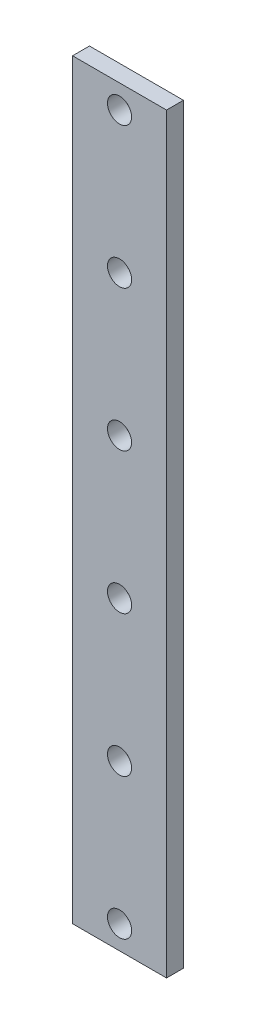
ISO-10303-21;
HEADER;
FILE_DESCRIPTION(('STEP AP214'),'2;1');
FILE_NAME('part.step','',(''),(''),'','','');
FILE_SCHEMA(('AUTOMOTIVE_DESIGN { 1 0 10303 214 1 1 1 1 }'));
ENDSEC;
DATA;
#1=APPLICATION_CONTEXT('core data for automotive mechanical design processes');
#2=APPLICATION_PROTOCOL_DEFINITION('international standard','automotive_design',2000,#1);
#3=PRODUCT_CONTEXT('',#1,'mechanical');
#4=PRODUCT('Part','Part','',(#3));
#5=PRODUCT_RELATED_PRODUCT_CATEGORY('part','',(#4));
#6=PRODUCT_DEFINITION_FORMATION('','',#4);
#7=PRODUCT_DEFINITION_CONTEXT('part definition',#1,'design');
#8=PRODUCT_DEFINITION('design','',#6,#7);
#9=PRODUCT_DEFINITION_SHAPE('','',#8);
#10=(LENGTH_UNIT() NAMED_UNIT(*) SI_UNIT(.MILLI.,.METRE.));
#11=(NAMED_UNIT(*) PLANE_ANGLE_UNIT() SI_UNIT($,.RADIAN.));
#12=(NAMED_UNIT(*) SI_UNIT($,.STERADIAN.) SOLID_ANGLE_UNIT());
#13=UNCERTAINTY_MEASURE_WITH_UNIT(LENGTH_MEASURE(1.E-05),#10,'distance_accuracy_value','');
#14=(GEOMETRIC_REPRESENTATION_CONTEXT(3) GLOBAL_UNCERTAINTY_ASSIGNED_CONTEXT((#13)) GLOBAL_UNIT_ASSIGNED_CONTEXT((#10,
#11,#12)) REPRESENTATION_CONTEXT('',''));
#15=CARTESIAN_POINT('',(0.,0.,0.));
#16=DIRECTION('',(0.,0.,1.));
#17=DIRECTION('',(1.,0.,0.));
#18=AXIS2_PLACEMENT_3D('',#15,#16,#17);
#19=CARTESIAN_POINT('',(6.35,50.8,1.143));
#20=DIRECTION('',(-1.,0.,0.));
#21=DIRECTION('',(0.,-1.,0.));
#22=AXIS2_PLACEMENT_3D('',#19,#20,#21);
#23=PLANE('',#22);
#24=DIRECTION('',(0.,1.,0.));
#25=VECTOR('',#24,1.);
#26=CARTESIAN_POINT('',(6.35,50.8,-1.143));
#27=LINE('',#26,#25);
#28=CARTESIAN_POINT('',(6.35000000000001,-50.8,-1.143));
#29=VERTEX_POINT('',#28);
#30=CARTESIAN_POINT('',(6.35,50.8,-1.143));
#31=VERTEX_POINT('',#30);
#32=EDGE_CURVE('E96',#29,#31,#27,.T.);
#33=ORIENTED_EDGE('',*,*,#32,.T.);
#34=DIRECTION('',(0.,0.,-1.));
#35=VECTOR('',#34,1.);
#36=CARTESIAN_POINT('',(6.35,50.8,1.143));
#37=LINE('',#36,#35);
#38=CARTESIAN_POINT('',(6.35,50.8,1.143));
#39=VERTEX_POINT('',#38);
#40=EDGE_CURVE('E11',#39,#31,#37,.T.);
#41=ORIENTED_EDGE('',*,*,#40,.F.);
#42=DIRECTION('',(0.,1.,0.));
#43=VECTOR('',#42,1.);
#44=CARTESIAN_POINT('',(6.35,50.8,1.143));
#45=LINE('',#44,#43);
#46=CARTESIAN_POINT('',(6.35000000000001,-50.8,1.143));
#47=VERTEX_POINT('',#46);
#48=EDGE_CURVE('E84',#47,#39,#45,.T.);
#49=ORIENTED_EDGE('',*,*,#48,.F.);
#50=DIRECTION('',(0.,0.,-1.));
#51=VECTOR('',#50,1.);
#52=CARTESIAN_POINT('',(6.35000000000001,-50.8,1.143));
#53=LINE('',#52,#51);
#54=EDGE_CURVE('E92',#47,#29,#53,.T.);
#55=ORIENTED_EDGE('',*,*,#54,.T.);
#56=EDGE_LOOP('',(#33,#41,#49,#55));
#57=FACE_BOUND('',#56,.T.);
#58=ADVANCED_FACE('F33',(#57),#23,.F.);
#59=CARTESIAN_POINT('',(-6.35,50.8,1.143));
#60=DIRECTION('',(0.,-1.,0.));
#61=DIRECTION('',(0.,0.,-1.));
#62=AXIS2_PLACEMENT_3D('',#59,#60,#61);
#63=PLANE('',#62);
#64=DIRECTION('',(-1.,0.,0.));
#65=VECTOR('',#64,1.);
#66=CARTESIAN_POINT('',(-6.35,50.8,-1.143));
#67=LINE('',#66,#65);
#68=CARTESIAN_POINT('',(-6.35,50.8,-1.143));
#69=VERTEX_POINT('',#68);
#70=EDGE_CURVE('E88',#31,#69,#67,.T.);
#71=ORIENTED_EDGE('',*,*,#70,.T.);
#72=DIRECTION('',(0.,0.,-1.));
#73=VECTOR('',#72,1.);
#74=CARTESIAN_POINT('',(-6.35,50.8,1.143));
#75=LINE('',#74,#73);
#76=CARTESIAN_POINT('',(-6.35,50.8,1.143));
#77=VERTEX_POINT('',#76);
#78=EDGE_CURVE('E41',#77,#69,#75,.T.);
#79=ORIENTED_EDGE('',*,*,#78,.F.);
#80=DIRECTION('',(-1.,0.,0.));
#81=VECTOR('',#80,1.);
#82=CARTESIAN_POINT('',(-6.35,50.8,1.143));
#83=LINE('',#82,#81);
#84=EDGE_CURVE('E79',#39,#77,#83,.T.);
#85=ORIENTED_EDGE('',*,*,#84,.F.);
#86=ORIENTED_EDGE('',*,*,#40,.T.);
#87=EDGE_LOOP('',(#71,#79,#85,#86));
#88=FACE_BOUND('',#87,.T.);
#89=ADVANCED_FACE('F87',(#88),#63,.F.);
#90=CARTESIAN_POINT('',(-6.35,50.8,1.143));
#91=DIRECTION('',(1.,0.,0.));
#92=DIRECTION('',(0.,1.,0.));
#93=AXIS2_PLACEMENT_3D('',#90,#91,#92);
#94=PLANE('',#93);
#95=DIRECTION('',(0.,-1.,0.));
#96=VECTOR('',#95,1.);
#97=CARTESIAN_POINT('',(-6.35,50.8,-1.143));
#98=LINE('',#97,#96);
#99=CARTESIAN_POINT('',(-6.34999999999999,-50.8,-1.143));
#100=VERTEX_POINT('',#99);
#101=EDGE_CURVE('E66',#69,#100,#98,.T.);
#102=ORIENTED_EDGE('',*,*,#101,.T.);
#103=DIRECTION('',(0.,0.,-1.));
#104=VECTOR('',#103,1.);
#105=CARTESIAN_POINT('',(-6.34999999999999,-50.8,1.143));
#106=LINE('',#105,#104);
#107=CARTESIAN_POINT('',(-6.34999999999999,-50.8,1.143));
#108=VERTEX_POINT('',#107);
#109=EDGE_CURVE('E89',#108,#100,#106,.T.);
#110=ORIENTED_EDGE('',*,*,#109,.F.);
#111=DIRECTION('',(0.,-1.,0.));
#112=VECTOR('',#111,1.);
#113=CARTESIAN_POINT('',(-6.35,50.8,1.143));
#114=LINE('',#113,#112);
#115=EDGE_CURVE('E82',#77,#108,#114,.T.);
#116=ORIENTED_EDGE('',*,*,#115,.F.);
#117=ORIENTED_EDGE('',*,*,#78,.T.);
#118=EDGE_LOOP('',(#102,#110,#116,#117));
#119=FACE_BOUND('',#118,.T.);
#120=ADVANCED_FACE('F90',(#119),#94,.F.);
#121=CARTESIAN_POINT('',(-6.34999999999999,-50.8,1.143));
#122=DIRECTION('',(0.,1.,0.));
#123=DIRECTION('',(0.,0.,1.));
#124=AXIS2_PLACEMENT_3D('',#121,#122,#123);
#125=PLANE('',#124);
#126=DIRECTION('',(1.,0.,0.));
#127=VECTOR('',#126,1.);
#128=CARTESIAN_POINT('',(-6.34999999999999,-50.8,-1.143));
#129=LINE('',#128,#127);
#130=EDGE_CURVE('E72',#100,#29,#129,.T.);
#131=ORIENTED_EDGE('',*,*,#130,.T.);
#132=ORIENTED_EDGE('',*,*,#54,.F.);
#133=DIRECTION('',(1.,0.,0.));
#134=VECTOR('',#133,1.);
#135=CARTESIAN_POINT('',(-6.34999999999999,-50.8,1.143));
#136=LINE('',#135,#134);
#137=EDGE_CURVE('E49',#108,#47,#136,.T.);
#138=ORIENTED_EDGE('',*,*,#137,.F.);
#139=ORIENTED_EDGE('',*,*,#109,.T.);
#140=EDGE_LOOP('',(#131,#132,#138,#139));
#141=FACE_BOUND('',#140,.T.);
#142=ADVANCED_FACE('F104',(#141),#125,.F.);
#143=CARTESIAN_POINT('',(0.,0.,1.143));
#144=DIRECTION('',(0.,0.,1.));
#145=DIRECTION('',(1.,0.,0.));
#146=AXIS2_PLACEMENT_3D('',#143,#144,#145);
#147=PLANE('',#146);
#148=CARTESIAN_POINT('',(0.,47.625,1.143));
#149=DIRECTION('',(0.,0.,1.));
#150=DIRECTION('',(1.,0.,0.));
#151=AXIS2_PLACEMENT_3D('',#148,#149,#150);
#152=CIRCLE('',#151,1.63195);
#153=CARTESIAN_POINT('',(1.63195,47.625,1.143));
#154=VERTEX_POINT('',#153);
#155=EDGE_CURVE('E142',#154,#154,#152,.T.);
#156=ORIENTED_EDGE('',*,*,#155,.F.);
#157=EDGE_LOOP('',(#156));
#158=FACE_BOUND('',#157,.T.);
#159=CARTESIAN_POINT('',(1.99538158514885E-13,28.575,1.143));
#160=DIRECTION('',(0.,0.,1.));
#161=DIRECTION('',(1.,0.,0.));
#162=AXIS2_PLACEMENT_3D('',#159,#160,#161);
#163=CIRCLE('',#162,1.63195);
#164=CARTESIAN_POINT('',(1.6319500000002,28.575,1.143));
#165=VERTEX_POINT('',#164);
#166=EDGE_CURVE('E136',#165,#165,#163,.T.);
#167=ORIENTED_EDGE('',*,*,#166,.F.);
#168=EDGE_LOOP('',(#167));
#169=FACE_BOUND('',#168,.T.);
#170=CARTESIAN_POINT('',(3.9907631702977E-13,9.525,1.143));
#171=DIRECTION('',(0.,0.,1.));
#172=DIRECTION('',(1.,0.,0.));
#173=AXIS2_PLACEMENT_3D('',#170,#171,#172);
#174=CIRCLE('',#173,1.63195);
#175=CARTESIAN_POINT('',(1.6319500000004,9.525,1.143));
#176=VERTEX_POINT('',#175);
#177=EDGE_CURVE('E130',#176,#176,#174,.T.);
#178=ORIENTED_EDGE('',*,*,#177,.F.);
#179=EDGE_LOOP('',(#178));
#180=FACE_BOUND('',#179,.T.);
#181=CARTESIAN_POINT('',(5.98614475544655E-13,-9.52500000000001,1.143));
#182=DIRECTION('',(0.,0.,1.));
#183=DIRECTION('',(1.,0.,0.));
#184=AXIS2_PLACEMENT_3D('',#181,#182,#183);
#185=CIRCLE('',#184,1.63195);
#186=CARTESIAN_POINT('',(1.6319500000006,-9.52500000000001,1.143));
#187=VERTEX_POINT('',#186);
#188=EDGE_CURVE('E124',#187,#187,#185,.T.);
#189=ORIENTED_EDGE('',*,*,#188,.F.);
#190=EDGE_LOOP('',(#189));
#191=FACE_BOUND('',#190,.T.);
#192=CARTESIAN_POINT('',(7.9815263405954E-13,-28.575,1.143));
#193=DIRECTION('',(0.,0.,1.));
#194=DIRECTION('',(1.,0.,0.));
#195=AXIS2_PLACEMENT_3D('',#192,#193,#194);
#196=CIRCLE('',#195,1.63195);
#197=CARTESIAN_POINT('',(1.6319500000008,-28.575,1.143));
#198=VERTEX_POINT('',#197);
#199=EDGE_CURVE('E118',#198,#198,#196,.T.);
#200=ORIENTED_EDGE('',*,*,#199,.F.);
#201=EDGE_LOOP('',(#200));
#202=FACE_BOUND('',#201,.T.);
#203=CARTESIAN_POINT('',(9.97690792574425E-13,-47.625,1.143));
#204=DIRECTION('',(0.,0.,1.));
#205=DIRECTION('',(1.,0.,0.));
#206=AXIS2_PLACEMENT_3D('',#203,#204,#205);
#207=CIRCLE('',#206,1.63195);
#208=CARTESIAN_POINT('',(1.631950000001,-47.625,1.143));
#209=VERTEX_POINT('',#208);
#210=EDGE_CURVE('E112',#209,#209,#207,.T.);
#211=ORIENTED_EDGE('',*,*,#210,.F.);
#212=EDGE_LOOP('',(#211));
#213=FACE_BOUND('',#212,.T.);
#214=ORIENTED_EDGE('',*,*,#48,.T.);
#215=ORIENTED_EDGE('',*,*,#84,.T.);
#216=ORIENTED_EDGE('',*,*,#115,.T.);
#217=ORIENTED_EDGE('',*,*,#137,.T.);
#218=EDGE_LOOP('',(#214,#215,#216,#217));
#219=FACE_BOUND('',#218,.T.);
#220=ADVANCED_FACE('F80',(#158,#169,#180,#191,#202,#213,#219),#147,.T.);
#221=CARTESIAN_POINT('',(0.,0.,-1.143));
#222=DIRECTION('',(0.,0.,1.));
#223=DIRECTION('',(1.,0.,0.));
#224=AXIS2_PLACEMENT_3D('',#221,#222,#223);
#225=PLANE('',#224);
#226=CARTESIAN_POINT('',(0.,47.625,-1.143));
#227=DIRECTION('',(0.,0.,1.));
#228=DIRECTION('',(1.,0.,0.));
#229=AXIS2_PLACEMENT_3D('',#226,#227,#228);
#230=CIRCLE('',#229,1.63195);
#231=CARTESIAN_POINT('',(1.63195,47.625,-1.143));
#232=VERTEX_POINT('',#231);
#233=EDGE_CURVE('E139',#232,#232,#230,.T.);
#234=ORIENTED_EDGE('',*,*,#233,.T.);
#235=EDGE_LOOP('',(#234));
#236=FACE_BOUND('',#235,.T.);
#237=CARTESIAN_POINT('',(1.99538158514885E-13,28.575,-1.143));
#238=DIRECTION('',(0.,0.,1.));
#239=DIRECTION('',(1.,0.,0.));
#240=AXIS2_PLACEMENT_3D('',#237,#238,#239);
#241=CIRCLE('',#240,1.63195);
#242=CARTESIAN_POINT('',(1.6319500000002,28.575,-1.143));
#243=VERTEX_POINT('',#242);
#244=EDGE_CURVE('E133',#243,#243,#241,.T.);
#245=ORIENTED_EDGE('',*,*,#244,.T.);
#246=EDGE_LOOP('',(#245));
#247=FACE_BOUND('',#246,.T.);
#248=CARTESIAN_POINT('',(3.9907631702977E-13,9.525,-1.143));
#249=DIRECTION('',(0.,0.,1.));
#250=DIRECTION('',(1.,0.,0.));
#251=AXIS2_PLACEMENT_3D('',#248,#249,#250);
#252=CIRCLE('',#251,1.63195);
#253=CARTESIAN_POINT('',(1.6319500000004,9.525,-1.143));
#254=VERTEX_POINT('',#253);
#255=EDGE_CURVE('E127',#254,#254,#252,.T.);
#256=ORIENTED_EDGE('',*,*,#255,.T.);
#257=EDGE_LOOP('',(#256));
#258=FACE_BOUND('',#257,.T.);
#259=CARTESIAN_POINT('',(5.98614475544655E-13,-9.52500000000001,-1.143));
#260=DIRECTION('',(0.,0.,1.));
#261=DIRECTION('',(1.,0.,0.));
#262=AXIS2_PLACEMENT_3D('',#259,#260,#261);
#263=CIRCLE('',#262,1.63195);
#264=CARTESIAN_POINT('',(1.6319500000006,-9.52500000000001,-1.143));
#265=VERTEX_POINT('',#264);
#266=EDGE_CURVE('E121',#265,#265,#263,.T.);
#267=ORIENTED_EDGE('',*,*,#266,.T.);
#268=EDGE_LOOP('',(#267));
#269=FACE_BOUND('',#268,.T.);
#270=CARTESIAN_POINT('',(7.9815263405954E-13,-28.575,-1.143));
#271=DIRECTION('',(0.,0.,1.));
#272=DIRECTION('',(1.,0.,0.));
#273=AXIS2_PLACEMENT_3D('',#270,#271,#272);
#274=CIRCLE('',#273,1.63195);
#275=CARTESIAN_POINT('',(1.6319500000008,-28.575,-1.143));
#276=VERTEX_POINT('',#275);
#277=EDGE_CURVE('E115',#276,#276,#274,.T.);
#278=ORIENTED_EDGE('',*,*,#277,.T.);
#279=EDGE_LOOP('',(#278));
#280=FACE_BOUND('',#279,.T.);
#281=CARTESIAN_POINT('',(9.97690792574425E-13,-47.625,-1.143));
#282=DIRECTION('',(0.,0.,1.));
#283=DIRECTION('',(1.,0.,0.));
#284=AXIS2_PLACEMENT_3D('',#281,#282,#283);
#285=CIRCLE('',#284,1.63195);
#286=CARTESIAN_POINT('',(1.631950000001,-47.625,-1.143));
#287=VERTEX_POINT('',#286);
#288=EDGE_CURVE('E99',#287,#287,#285,.T.);
#289=ORIENTED_EDGE('',*,*,#288,.T.);
#290=EDGE_LOOP('',(#289));
#291=FACE_BOUND('',#290,.T.);
#292=ORIENTED_EDGE('',*,*,#32,.F.);
#293=ORIENTED_EDGE('',*,*,#130,.F.);
#294=ORIENTED_EDGE('',*,*,#101,.F.);
#295=ORIENTED_EDGE('',*,*,#70,.F.);
#296=EDGE_LOOP('',(#292,#293,#294,#295));
#297=FACE_BOUND('',#296,.T.);
#298=ADVANCED_FACE('F107',(#236,#247,#258,#269,#280,#291,#297),#225,.F.);
#299=CARTESIAN_POINT('',(9.97690792574425E-13,-47.625,1.143));
#300=DIRECTION('',(0.,0.,1.));
#301=DIRECTION('',(1.,0.,0.));
#302=AXIS2_PLACEMENT_3D('',#299,#300,#301);
#303=CYLINDRICAL_SURFACE('',#302,1.63195);
#304=ORIENTED_EDGE('',*,*,#288,.F.);
#305=EDGE_LOOP('',(#304));
#306=FACE_BOUND('',#305,.T.);
#307=ORIENTED_EDGE('',*,*,#210,.T.);
#308=EDGE_LOOP('',(#307));
#309=FACE_BOUND('',#308,.T.);
#310=ADVANCED_FACE('F161',(#306,#309),#303,.F.);
#311=CARTESIAN_POINT('',(7.9815263405954E-13,-28.575,1.143));
#312=DIRECTION('',(0.,0.,1.));
#313=DIRECTION('',(1.,0.,0.));
#314=AXIS2_PLACEMENT_3D('',#311,#312,#313);
#315=CYLINDRICAL_SURFACE('',#314,1.63195);
#316=ORIENTED_EDGE('',*,*,#277,.F.);
#317=EDGE_LOOP('',(#316));
#318=FACE_BOUND('',#317,.T.);
#319=ORIENTED_EDGE('',*,*,#199,.T.);
#320=EDGE_LOOP('',(#319));
#321=FACE_BOUND('',#320,.T.);
#322=ADVANCED_FACE('F163',(#318,#321),#315,.F.);
#323=CARTESIAN_POINT('',(5.98614475544655E-13,-9.52500000000001,1.143));
#324=DIRECTION('',(0.,0.,1.));
#325=DIRECTION('',(1.,0.,0.));
#326=AXIS2_PLACEMENT_3D('',#323,#324,#325);
#327=CYLINDRICAL_SURFACE('',#326,1.63195);
#328=ORIENTED_EDGE('',*,*,#266,.F.);
#329=EDGE_LOOP('',(#328));
#330=FACE_BOUND('',#329,.T.);
#331=ORIENTED_EDGE('',*,*,#188,.T.);
#332=EDGE_LOOP('',(#331));
#333=FACE_BOUND('',#332,.T.);
#334=ADVANCED_FACE('F170',(#330,#333),#327,.F.);
#335=CARTESIAN_POINT('',(3.9907631702977E-13,9.525,1.143));
#336=DIRECTION('',(0.,0.,1.));
#337=DIRECTION('',(1.,0.,0.));
#338=AXIS2_PLACEMENT_3D('',#335,#336,#337);
#339=CYLINDRICAL_SURFACE('',#338,1.63195);
#340=ORIENTED_EDGE('',*,*,#255,.F.);
#341=EDGE_LOOP('',(#340));
#342=FACE_BOUND('',#341,.T.);
#343=ORIENTED_EDGE('',*,*,#177,.T.);
#344=EDGE_LOOP('',(#343));
#345=FACE_BOUND('',#344,.T.);
#346=ADVANCED_FACE('F217',(#342,#345),#339,.F.);
#347=CARTESIAN_POINT('',(1.99538158514885E-13,28.575,1.143));
#348=DIRECTION('',(0.,0.,1.));
#349=DIRECTION('',(1.,0.,0.));
#350=AXIS2_PLACEMENT_3D('',#347,#348,#349);
#351=CYLINDRICAL_SURFACE('',#350,1.63195);
#352=ORIENTED_EDGE('',*,*,#244,.F.);
#353=EDGE_LOOP('',(#352));
#354=FACE_BOUND('',#353,.T.);
#355=ORIENTED_EDGE('',*,*,#166,.T.);
#356=EDGE_LOOP('',(#355));
#357=FACE_BOUND('',#356,.T.);
#358=ADVANCED_FACE('F227',(#354,#357),#351,.F.);
#359=CARTESIAN_POINT('',(0.,47.625,1.143));
#360=DIRECTION('',(0.,0.,1.));
#361=DIRECTION('',(1.,0.,0.));
#362=AXIS2_PLACEMENT_3D('',#359,#360,#361);
#363=CYLINDRICAL_SURFACE('',#362,1.63195);
#364=ORIENTED_EDGE('',*,*,#233,.F.);
#365=EDGE_LOOP('',(#364));
#366=FACE_BOUND('',#365,.T.);
#367=ORIENTED_EDGE('',*,*,#155,.T.);
#368=EDGE_LOOP('',(#367));
#369=FACE_BOUND('',#368,.T.);
#370=ADVANCED_FACE('F146',(#366,#369),#363,.F.);
#371=CLOSED_SHELL('',(#58,#89,#120,#142,#220,#298,#310,#322,#334,#346,#358,#370));
#372=MANIFOLD_SOLID_BREP('B2',#371);
#373=ADVANCED_BREP_SHAPE_REPRESENTATION('',(#18,#372),#14);
#374=SHAPE_DEFINITION_REPRESENTATION(#9,#373);
ENDSEC;
END-ISO-10303-21;
